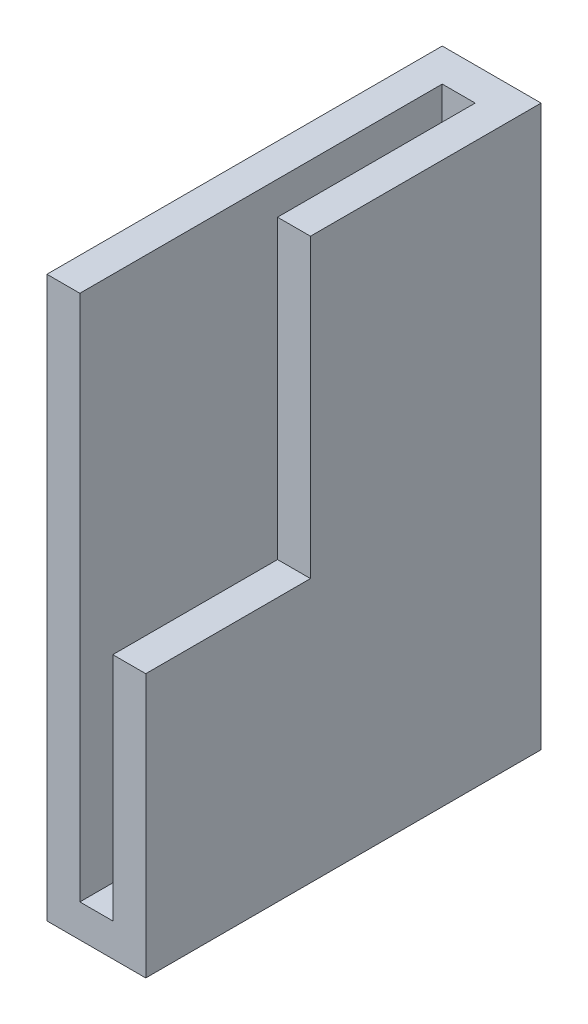
ISO-10303-21;
HEADER;
FILE_DESCRIPTION(('STEP AP214'),'2;1');
FILE_NAME('part.step','',(''),(''),'','','');
FILE_SCHEMA(('AUTOMOTIVE_DESIGN { 1 0 10303 214 1 1 1 1 }'));
ENDSEC;
DATA;
#1=APPLICATION_CONTEXT('core data for automotive mechanical design processes');
#2=APPLICATION_PROTOCOL_DEFINITION('international standard','automotive_design',2000,#1);
#3=PRODUCT_CONTEXT('',#1,'mechanical');
#4=PRODUCT('Part','Part','',(#3));
#5=PRODUCT_RELATED_PRODUCT_CATEGORY('part','',(#4));
#6=PRODUCT_DEFINITION_FORMATION('','',#4);
#7=PRODUCT_DEFINITION_CONTEXT('part definition',#1,'design');
#8=PRODUCT_DEFINITION('design','',#6,#7);
#9=PRODUCT_DEFINITION_SHAPE('','',#8);
#10=(LENGTH_UNIT() NAMED_UNIT(*) SI_UNIT(.MILLI.,.METRE.));
#11=(NAMED_UNIT(*) PLANE_ANGLE_UNIT() SI_UNIT($,.RADIAN.));
#12=(NAMED_UNIT(*) SI_UNIT($,.STERADIAN.) SOLID_ANGLE_UNIT());
#13=UNCERTAINTY_MEASURE_WITH_UNIT(LENGTH_MEASURE(1.E-05),#10,'distance_accuracy_value','');
#14=(GEOMETRIC_REPRESENTATION_CONTEXT(3) GLOBAL_UNCERTAINTY_ASSIGNED_CONTEXT((#13)) GLOBAL_UNIT_ASSIGNED_CONTEXT((#10,
#11,#12)) REPRESENTATION_CONTEXT('',''));
#15=CARTESIAN_POINT('',(0.,0.,0.));
#16=DIRECTION('',(0.,0.,1.));
#17=DIRECTION('',(1.,0.,0.));
#18=AXIS2_PLACEMENT_3D('',#15,#16,#17);
#19=CARTESIAN_POINT('',(3.,0.,0.));
#20=DIRECTION('',(0.,0.,-1.));
#21=DIRECTION('',(0.,1.,0.));
#22=AXIS2_PLACEMENT_3D('',#19,#20,#21);
#23=PLANE('',#22);
#24=DIRECTION('',(0.,-1.,0.));
#25=VECTOR('',#24,1.);
#26=CARTESIAN_POINT('',(3.,0.,0.));
#27=LINE('',#26,#25);
#28=CARTESIAN_POINT('',(3.,-9.,0.));
#29=VERTEX_POINT('',#28);
#30=CARTESIAN_POINT('',(3.,-17.,0.));
#31=VERTEX_POINT('',#30);
#32=EDGE_CURVE('E84',#29,#31,#27,.T.);
#33=ORIENTED_EDGE('',*,*,#32,.F.);
#34=DIRECTION('',(1.,0.,0.));
#35=VECTOR('',#34,1.);
#36=CARTESIAN_POINT('',(-0.00100000000000013,-9.,0.));
#37=LINE('',#36,#35);
#38=CARTESIAN_POINT('',(2.,-9.,0.));
#39=VERTEX_POINT('',#38);
#40=EDGE_CURVE('E144',#39,#29,#37,.T.);
#41=ORIENTED_EDGE('',*,*,#40,.F.);
#42=DIRECTION('',(0.,1.,0.));
#43=VECTOR('',#42,1.);
#44=CARTESIAN_POINT('',(2.,-16.,0.));
#45=LINE('',#44,#43);
#46=CARTESIAN_POINT('',(2.,-16.,0.));
#47=VERTEX_POINT('',#46);
#48=EDGE_CURVE('E139',#47,#39,#45,.T.);
#49=ORIENTED_EDGE('',*,*,#48,.F.);
#50=DIRECTION('',(1.,0.,0.));
#51=VECTOR('',#50,1.);
#52=CARTESIAN_POINT('',(1.,-16.,0.));
#53=LINE('',#52,#51);
#54=CARTESIAN_POINT('',(1.,-16.,0.));
#55=VERTEX_POINT('',#54);
#56=EDGE_CURVE('E151',#55,#47,#53,.T.);
#57=ORIENTED_EDGE('',*,*,#56,.F.);
#58=DIRECTION('',(0.,1.,0.));
#59=VECTOR('',#58,1.);
#60=CARTESIAN_POINT('',(1.,-16.,0.));
#61=LINE('',#60,#59);
#62=CARTESIAN_POINT('',(1.,0.,0.));
#63=VERTEX_POINT('',#62);
#64=EDGE_CURVE('E161',#55,#63,#61,.T.);
#65=ORIENTED_EDGE('',*,*,#64,.T.);
#66=DIRECTION('',(-1.,0.,0.));
#67=VECTOR('',#66,1.);
#68=CARTESIAN_POINT('',(3.,0.,0.));
#69=LINE('',#68,#67);
#70=CARTESIAN_POINT('',(0.,0.,0.));
#71=VERTEX_POINT('',#70);
#72=EDGE_CURVE('E79',#63,#71,#69,.T.);
#73=ORIENTED_EDGE('',*,*,#72,.T.);
#74=DIRECTION('',(0.,-1.,0.));
#75=VECTOR('',#74,1.);
#76=CARTESIAN_POINT('',(0.,0.,0.));
#77=LINE('',#76,#75);
#78=CARTESIAN_POINT('',(0.,-17.,0.));
#79=VERTEX_POINT('',#78);
#80=EDGE_CURVE('E169',#71,#79,#77,.T.);
#81=ORIENTED_EDGE('',*,*,#80,.T.);
#82=DIRECTION('',(-1.,0.,0.));
#83=VECTOR('',#82,1.);
#84=CARTESIAN_POINT('',(3.,-17.,0.));
#85=LINE('',#84,#83);
#86=EDGE_CURVE('E11',#31,#79,#85,.T.);
#87=ORIENTED_EDGE('',*,*,#86,.F.);
#88=EDGE_LOOP('',(#33,#41,#49,#57,#65,#73,#81,#87));
#89=FACE_BOUND('',#88,.T.);
#90=ADVANCED_FACE('F35',(#89),#23,.F.);
#91=CARTESIAN_POINT('',(3.,-17.,0.));
#92=DIRECTION('',(0.,1.,0.));
#93=DIRECTION('',(0.,0.,1.));
#94=AXIS2_PLACEMENT_3D('',#91,#92,#93);
#95=PLANE('',#94);
#96=DIRECTION('',(0.,0.,-1.));
#97=VECTOR('',#96,1.);
#98=CARTESIAN_POINT('',(0.,-17.,0.));
#99=LINE('',#98,#97);
#100=CARTESIAN_POINT('',(0.,-17.,-12.));
#101=VERTEX_POINT('',#100);
#102=EDGE_CURVE('E183',#79,#101,#99,.T.);
#103=ORIENTED_EDGE('',*,*,#102,.T.);
#104=DIRECTION('',(-1.,0.,0.));
#105=VECTOR('',#104,1.);
#106=CARTESIAN_POINT('',(3.,-17.,-12.));
#107=LINE('',#106,#105);
#108=CARTESIAN_POINT('',(3.,-17.,-12.));
#109=VERTEX_POINT('',#108);
#110=EDGE_CURVE('E42',#109,#101,#107,.T.);
#111=ORIENTED_EDGE('',*,*,#110,.F.);
#112=DIRECTION('',(0.,0.,-1.));
#113=VECTOR('',#112,1.);
#114=CARTESIAN_POINT('',(3.,-17.,0.));
#115=LINE('',#114,#113);
#116=EDGE_CURVE('E176',#31,#109,#115,.T.);
#117=ORIENTED_EDGE('',*,*,#116,.F.);
#118=ORIENTED_EDGE('',*,*,#86,.T.);
#119=EDGE_LOOP('',(#103,#111,#117,#118));
#120=FACE_BOUND('',#119,.T.);
#121=ADVANCED_FACE('F207',(#120),#95,.F.);
#122=CARTESIAN_POINT('',(3.,0.,-12.));
#123=DIRECTION('',(0.,0.,1.));
#124=DIRECTION('',(0.,-1.,0.));
#125=AXIS2_PLACEMENT_3D('',#122,#123,#124);
#126=PLANE('',#125);
#127=DIRECTION('',(0.,1.,0.));
#128=VECTOR('',#127,1.);
#129=CARTESIAN_POINT('',(0.,0.,-12.));
#130=LINE('',#129,#128);
#131=CARTESIAN_POINT('',(0.,0.,-12.));
#132=VERTEX_POINT('',#131);
#133=EDGE_CURVE('E185',#101,#132,#130,.T.);
#134=ORIENTED_EDGE('',*,*,#133,.T.);
#135=DIRECTION('',(-1.,0.,0.));
#136=VECTOR('',#135,1.);
#137=CARTESIAN_POINT('',(3.,0.,-12.));
#138=LINE('',#137,#136);
#139=CARTESIAN_POINT('',(3.,0.,-12.));
#140=VERTEX_POINT('',#139);
#141=EDGE_CURVE('E189',#140,#132,#138,.T.);
#142=ORIENTED_EDGE('',*,*,#141,.F.);
#143=DIRECTION('',(0.,1.,0.));
#144=VECTOR('',#143,1.);
#145=CARTESIAN_POINT('',(3.,0.,-12.));
#146=LINE('',#145,#144);
#147=EDGE_CURVE('E58',#109,#140,#146,.T.);
#148=ORIENTED_EDGE('',*,*,#147,.F.);
#149=ORIENTED_EDGE('',*,*,#110,.T.);
#150=EDGE_LOOP('',(#134,#142,#148,#149));
#151=FACE_BOUND('',#150,.T.);
#152=ADVANCED_FACE('F195',(#151),#126,.F.);
#153=CARTESIAN_POINT('',(3.,0.,0.));
#154=DIRECTION('',(0.,-1.,0.));
#155=DIRECTION('',(0.,0.,-1.));
#156=AXIS2_PLACEMENT_3D('',#153,#154,#155);
#157=PLANE('',#156);
#158=DIRECTION('',(0.,0.,-1.));
#159=VECTOR('',#158,1.);
#160=CARTESIAN_POINT('',(2.,0.,0.));
#161=LINE('',#160,#159);
#162=CARTESIAN_POINT('',(2.,0.,-5.));
#163=VERTEX_POINT('',#162);
#164=CARTESIAN_POINT('',(2.,0.,-11.));
#165=VERTEX_POINT('',#164);
#166=EDGE_CURVE('E163',#163,#165,#161,.T.);
#167=ORIENTED_EDGE('',*,*,#166,.F.);
#168=DIRECTION('',(1.,0.,0.));
#169=VECTOR('',#168,1.);
#170=CARTESIAN_POINT('',(-0.00100000000000013,0.,-5.));
#171=LINE('',#170,#169);
#172=CARTESIAN_POINT('',(3.,0.,-5.));
#173=VERTEX_POINT('',#172);
#174=EDGE_CURVE('E49',#163,#173,#171,.T.);
#175=ORIENTED_EDGE('',*,*,#174,.T.);
#176=DIRECTION('',(0.,0.,1.));
#177=VECTOR('',#176,1.);
#178=CARTESIAN_POINT('',(3.,0.,0.));
#179=LINE('',#178,#177);
#180=EDGE_CURVE('E180',#140,#173,#179,.T.);
#181=ORIENTED_EDGE('',*,*,#180,.F.);
#182=ORIENTED_EDGE('',*,*,#141,.T.);
#183=DIRECTION('',(0.,0.,1.));
#184=VECTOR('',#183,1.);
#185=CARTESIAN_POINT('',(0.,0.,0.));
#186=LINE('',#185,#184);
#187=EDGE_CURVE('E177',#132,#71,#186,.T.);
#188=ORIENTED_EDGE('',*,*,#187,.T.);
#189=ORIENTED_EDGE('',*,*,#72,.F.);
#190=DIRECTION('',(0.,0.,1.));
#191=VECTOR('',#190,1.);
#192=CARTESIAN_POINT('',(1.,0.,0.));
#193=LINE('',#192,#191);
#194=CARTESIAN_POINT('',(1.,0.,-11.));
#195=VERTEX_POINT('',#194);
#196=EDGE_CURVE('E147',#195,#63,#193,.T.);
#197=ORIENTED_EDGE('',*,*,#196,.F.);
#198=DIRECTION('',(-1.,0.,0.));
#199=VECTOR('',#198,1.);
#200=CARTESIAN_POINT('',(1.,0.,-11.));
#201=LINE('',#200,#199);
#202=EDGE_CURVE('E152',#165,#195,#201,.T.);
#203=ORIENTED_EDGE('',*,*,#202,.F.);
#204=EDGE_LOOP('',(#167,#175,#181,#182,#188,#189,#197,#203));
#205=FACE_BOUND('',#204,.T.);
#206=ADVANCED_FACE('F202',(#205),#157,.F.);
#207=CARTESIAN_POINT('',(3.,0.,0.));
#208=DIRECTION('',(1.,0.,0.));
#209=DIRECTION('',(0.,0.,-1.));
#210=AXIS2_PLACEMENT_3D('',#207,#208,#209);
#211=PLANE('',#210);
#212=DIRECTION('',(0.,0.,-1.));
#213=VECTOR('',#212,1.);
#214=CARTESIAN_POINT('',(3.,-9.,0.));
#215=LINE('',#214,#213);
#216=CARTESIAN_POINT('',(3.,-9.,-5.));
#217=VERTEX_POINT('',#216);
#218=EDGE_CURVE('E127',#29,#217,#215,.T.);
#219=ORIENTED_EDGE('',*,*,#218,.F.);
#220=ORIENTED_EDGE('',*,*,#32,.T.);
#221=ORIENTED_EDGE('',*,*,#116,.T.);
#222=ORIENTED_EDGE('',*,*,#147,.T.);
#223=ORIENTED_EDGE('',*,*,#180,.T.);
#224=DIRECTION('',(0.,1.,0.));
#225=VECTOR('',#224,1.);
#226=CARTESIAN_POINT('',(3.,0.,-5.));
#227=LINE('',#226,#225);
#228=EDGE_CURVE('E129',#217,#173,#227,.T.);
#229=ORIENTED_EDGE('',*,*,#228,.F.);
#230=EDGE_LOOP('',(#219,#220,#221,#222,#223,#229));
#231=FACE_BOUND('',#230,.T.);
#232=ADVANCED_FACE('F205',(#231),#211,.T.);
#233=CARTESIAN_POINT('',(0.,0.,0.));
#234=DIRECTION('',(1.,0.,0.));
#235=DIRECTION('',(0.,0.,-1.));
#236=AXIS2_PLACEMENT_3D('',#233,#234,#235);
#237=PLANE('',#236);
#238=ORIENTED_EDGE('',*,*,#80,.F.);
#239=ORIENTED_EDGE('',*,*,#187,.F.);
#240=ORIENTED_EDGE('',*,*,#133,.F.);
#241=ORIENTED_EDGE('',*,*,#102,.F.);
#242=EDGE_LOOP('',(#238,#239,#240,#241));
#243=FACE_BOUND('',#242,.T.);
#244=ADVANCED_FACE('F200',(#243),#237,.F.);
#245=CARTESIAN_POINT('',(1.,-16.,0.));
#246=DIRECTION('',(-1.,0.,0.));
#247=DIRECTION('',(0.,0.,1.));
#248=AXIS2_PLACEMENT_3D('',#245,#246,#247);
#249=PLANE('',#248);
#250=ORIENTED_EDGE('',*,*,#196,.T.);
#251=ORIENTED_EDGE('',*,*,#64,.F.);
#252=DIRECTION('',(0.,0.,1.));
#253=VECTOR('',#252,1.);
#254=CARTESIAN_POINT('',(1.,-16.,0.));
#255=LINE('',#254,#253);
#256=CARTESIAN_POINT('',(1.,-16.,-11.));
#257=VERTEX_POINT('',#256);
#258=EDGE_CURVE('E148',#257,#55,#255,.T.);
#259=ORIENTED_EDGE('',*,*,#258,.F.);
#260=DIRECTION('',(0.,1.,0.));
#261=VECTOR('',#260,1.);
#262=CARTESIAN_POINT('',(1.,-16.,-11.));
#263=LINE('',#262,#261);
#264=EDGE_CURVE('E167',#257,#195,#263,.T.);
#265=ORIENTED_EDGE('',*,*,#264,.T.);
#266=EDGE_LOOP('',(#250,#251,#259,#265));
#267=FACE_BOUND('',#266,.T.);
#268=ADVANCED_FACE('F219',(#267),#249,.F.);
#269=CARTESIAN_POINT('',(1.,-16.,-11.));
#270=DIRECTION('',(0.,0.,-1.));
#271=DIRECTION('',(-1.,0.,0.));
#272=AXIS2_PLACEMENT_3D('',#269,#270,#271);
#273=PLANE('',#272);
#274=ORIENTED_EDGE('',*,*,#202,.T.);
#275=ORIENTED_EDGE('',*,*,#264,.F.);
#276=DIRECTION('',(-1.,0.,0.));
#277=VECTOR('',#276,1.);
#278=CARTESIAN_POINT('',(1.,-16.,-11.));
#279=LINE('',#278,#277);
#280=CARTESIAN_POINT('',(2.,-16.,-11.));
#281=VERTEX_POINT('',#280);
#282=EDGE_CURVE('E158',#281,#257,#279,.T.);
#283=ORIENTED_EDGE('',*,*,#282,.F.);
#284=DIRECTION('',(0.,1.,0.));
#285=VECTOR('',#284,1.);
#286=CARTESIAN_POINT('',(2.,-16.,-11.));
#287=LINE('',#286,#285);
#288=EDGE_CURVE('E170',#281,#165,#287,.T.);
#289=ORIENTED_EDGE('',*,*,#288,.T.);
#290=EDGE_LOOP('',(#274,#275,#283,#289));
#291=FACE_BOUND('',#290,.T.);
#292=ADVANCED_FACE('F224',(#291),#273,.F.);
#293=CARTESIAN_POINT('',(2.,-16.,0.));
#294=DIRECTION('',(1.,0.,0.));
#295=DIRECTION('',(0.,0.,-1.));
#296=AXIS2_PLACEMENT_3D('',#293,#294,#295);
#297=PLANE('',#296);
#298=ORIENTED_EDGE('',*,*,#48,.T.);
#299=DIRECTION('',(0.,0.,1.));
#300=VECTOR('',#299,1.);
#301=CARTESIAN_POINT('',(2.,-9.,0.));
#302=LINE('',#301,#300);
#303=CARTESIAN_POINT('',(2.,-9.,-5.));
#304=VERTEX_POINT('',#303);
#305=EDGE_CURVE('E125',#304,#39,#302,.T.);
#306=ORIENTED_EDGE('',*,*,#305,.F.);
#307=DIRECTION('',(0.,-1.,0.));
#308=VECTOR('',#307,1.);
#309=CARTESIAN_POINT('',(2.,0.,-5.));
#310=LINE('',#309,#308);
#311=EDGE_CURVE('E131',#163,#304,#310,.T.);
#312=ORIENTED_EDGE('',*,*,#311,.F.);
#313=ORIENTED_EDGE('',*,*,#166,.T.);
#314=ORIENTED_EDGE('',*,*,#288,.F.);
#315=DIRECTION('',(0.,0.,-1.));
#316=VECTOR('',#315,1.);
#317=CARTESIAN_POINT('',(2.,-16.,0.));
#318=LINE('',#317,#316);
#319=EDGE_CURVE('E155',#47,#281,#318,.T.);
#320=ORIENTED_EDGE('',*,*,#319,.F.);
#321=EDGE_LOOP('',(#298,#306,#312,#313,#314,#320));
#322=FACE_BOUND('',#321,.T.);
#323=ADVANCED_FACE('F137',(#322),#297,.F.);
#324=CARTESIAN_POINT('',(0.,-16.,0.));
#325=DIRECTION('',(0.,-1.,0.));
#326=DIRECTION('',(0.,0.,-1.));
#327=AXIS2_PLACEMENT_3D('',#324,#325,#326);
#328=PLANE('',#327);
#329=ORIENTED_EDGE('',*,*,#258,.T.);
#330=ORIENTED_EDGE('',*,*,#56,.T.);
#331=ORIENTED_EDGE('',*,*,#319,.T.);
#332=ORIENTED_EDGE('',*,*,#282,.T.);
#333=EDGE_LOOP('',(#329,#330,#331,#332));
#334=FACE_BOUND('',#333,.T.);
#335=ADVANCED_FACE('F228',(#334),#328,.F.);
#336=CARTESIAN_POINT('',(-0.00100000000000013,-9.,0.));
#337=DIRECTION('',(0.,-1.,0.));
#338=DIRECTION('',(0.,0.,-1.));
#339=AXIS2_PLACEMENT_3D('',#336,#337,#338);
#340=PLANE('',#339);
#341=ORIENTED_EDGE('',*,*,#305,.T.);
#342=ORIENTED_EDGE('',*,*,#40,.T.);
#343=ORIENTED_EDGE('',*,*,#218,.T.);
#344=DIRECTION('',(1.,0.,0.));
#345=VECTOR('',#344,1.);
#346=CARTESIAN_POINT('',(-0.00100000000000013,-9.,-5.));
#347=LINE('',#346,#345);
#348=EDGE_CURVE('E122',#304,#217,#347,.T.);
#349=ORIENTED_EDGE('',*,*,#348,.F.);
#350=EDGE_LOOP('',(#341,#342,#343,#349));
#351=FACE_BOUND('',#350,.T.);
#352=ADVANCED_FACE('F123',(#351),#340,.F.);
#353=CARTESIAN_POINT('',(-0.00100000000000013,0.,-5.));
#354=DIRECTION('',(0.,0.,-1.));
#355=DIRECTION('',(0.,1.,0.));
#356=AXIS2_PLACEMENT_3D('',#353,#354,#355);
#357=PLANE('',#356);
#358=ORIENTED_EDGE('',*,*,#311,.T.);
#359=ORIENTED_EDGE('',*,*,#348,.T.);
#360=ORIENTED_EDGE('',*,*,#228,.T.);
#361=ORIENTED_EDGE('',*,*,#174,.F.);
#362=EDGE_LOOP('',(#358,#359,#360,#361));
#363=FACE_BOUND('',#362,.T.);
#364=ADVANCED_FACE('F132',(#363),#357,.F.);
#365=CLOSED_SHELL('',(#90,#121,#152,#206,#232,#244,#268,#292,#323,#335,#352,#364));
#366=MANIFOLD_SOLID_BREP('B2',#365);
#367=ADVANCED_BREP_SHAPE_REPRESENTATION('',(#18,#366),#14);
#368=SHAPE_DEFINITION_REPRESENTATION(#9,#367);
ENDSEC;
END-ISO-10303-21;
